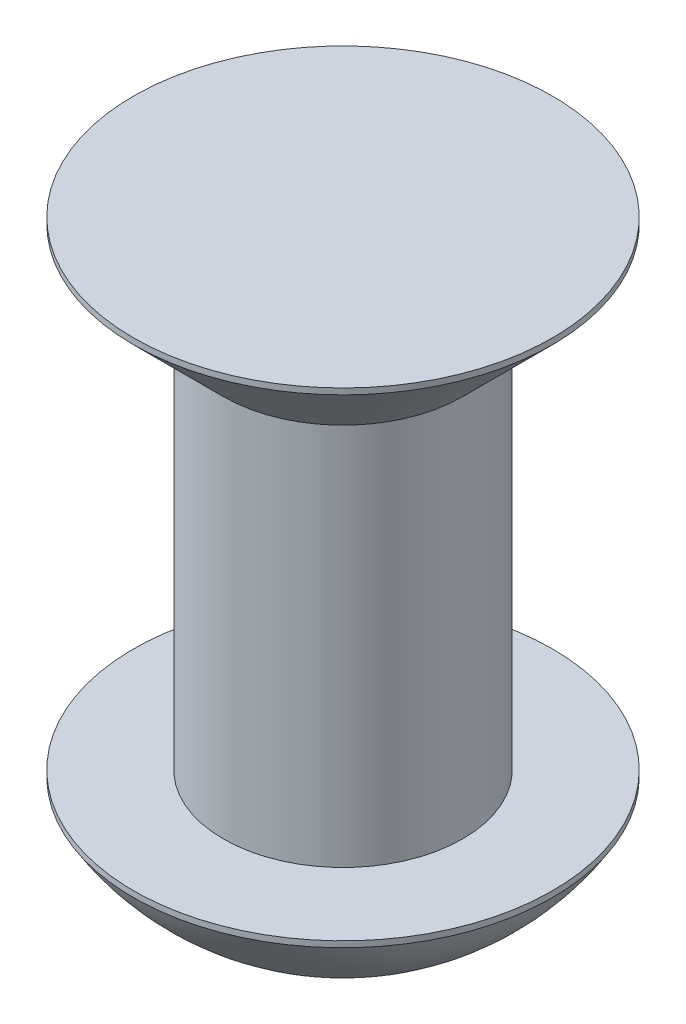
ISO-10303-21;
HEADER;
FILE_DESCRIPTION(('STEP AP214'),'2;1');
FILE_NAME('part.step','',(''),(''),'','','');
FILE_SCHEMA(('AUTOMOTIVE_DESIGN { 1 0 10303 214 1 1 1 1 }'));
ENDSEC;
DATA;
#1=APPLICATION_CONTEXT('core data for automotive mechanical design processes');
#2=APPLICATION_PROTOCOL_DEFINITION('international standard','automotive_design',2000,#1);
#3=PRODUCT_CONTEXT('',#1,'mechanical');
#4=PRODUCT('Part','Part','',(#3));
#5=PRODUCT_RELATED_PRODUCT_CATEGORY('part','',(#4));
#6=PRODUCT_DEFINITION_FORMATION('','',#4);
#7=PRODUCT_DEFINITION_CONTEXT('part definition',#1,'design');
#8=PRODUCT_DEFINITION('design','',#6,#7);
#9=PRODUCT_DEFINITION_SHAPE('','',#8);
#10=(LENGTH_UNIT() NAMED_UNIT(*) SI_UNIT(.MILLI.,.METRE.));
#11=(NAMED_UNIT(*) PLANE_ANGLE_UNIT() SI_UNIT($,.RADIAN.));
#12=(NAMED_UNIT(*) SI_UNIT($,.STERADIAN.) SOLID_ANGLE_UNIT());
#13=UNCERTAINTY_MEASURE_WITH_UNIT(LENGTH_MEASURE(1.E-05),#10,'distance_accuracy_value','');
#14=(GEOMETRIC_REPRESENTATION_CONTEXT(3) GLOBAL_UNCERTAINTY_ASSIGNED_CONTEXT((#13)) GLOBAL_UNIT_ASSIGNED_CONTEXT((#10,
#11,#12)) REPRESENTATION_CONTEXT('',''));
#15=CARTESIAN_POINT('',(0.,0.,0.));
#16=DIRECTION('',(0.,0.,1.));
#17=DIRECTION('',(1.,0.,0.));
#18=AXIS2_PLACEMENT_3D('',#15,#16,#17);
#19=CARTESIAN_POINT('',(3.5,7.6,0.));
#20=DIRECTION('',(0.,-1.,0.));
#21=DIRECTION('',(0.,0.,-1.));
#22=AXIS2_PLACEMENT_3D('',#19,#20,#21);
#23=PLANE('',#22);
#24=CARTESIAN_POINT('',(0.,7.6,0.));
#25=DIRECTION('',(0.,1.,0.));
#26=DIRECTION('',(0.,0.,1.));
#27=AXIS2_PLACEMENT_3D('',#24,#25,#26);
#28=CIRCLE('',#27,3.5);
#29=CARTESIAN_POINT('',(0.,7.6,3.5));
#30=VERTEX_POINT('',#29);
#31=EDGE_CURVE('E11',#30,#30,#28,.T.);
#32=ORIENTED_EDGE('',*,*,#31,.T.);
#33=EDGE_LOOP('',(#32));
#34=FACE_BOUND('',#33,.T.);
#35=ADVANCED_FACE('F31',(#34),#23,.F.);
#36=CARTESIAN_POINT('',(0.,11.2839721254355,0.));
#37=DIRECTION('',(0.,1.,0.));
#38=DIRECTION('',(0.,0.,1.));
#39=AXIS2_PLACEMENT_3D('',#36,#37,#38);
#40=CYLINDRICAL_SURFACE('',#39,3.5);
#41=ORIENTED_EDGE('',*,*,#31,.F.);
#42=EDGE_LOOP('',(#41));
#43=FACE_BOUND('',#42,.T.);
#44=CARTESIAN_POINT('',(0.,7.49999999999999,0.));
#45=DIRECTION('',(0.,1.,0.));
#46=DIRECTION('',(0.,0.,1.));
#47=AXIS2_PLACEMENT_3D('',#44,#45,#46);
#48=CIRCLE('',#47,3.5);
#49=CARTESIAN_POINT('',(0.,7.49999999999999,3.5));
#50=VERTEX_POINT('',#49);
#51=EDGE_CURVE('E39',#50,#50,#48,.T.);
#52=ORIENTED_EDGE('',*,*,#51,.T.);
#53=EDGE_LOOP('',(#52));
#54=FACE_BOUND('',#53,.T.);
#55=ADVANCED_FACE('F72',(#43,#54),#40,.T.);
#56=CARTESIAN_POINT('',(0.,6.,0.));
#57=DIRECTION('',(0.,1.,0.));
#58=DIRECTION('',(0.,0.,1.));
#59=AXIS2_PLACEMENT_3D('',#56,#57,#58);
#60=CONICAL_SURFACE('',#59,2.,0.78539816339745);
#61=ORIENTED_EDGE('',*,*,#51,.F.);
#62=EDGE_LOOP('',(#61));
#63=FACE_BOUND('',#62,.T.);
#64=CARTESIAN_POINT('',(0.,6.,0.));
#65=DIRECTION('',(0.,1.,0.));
#66=DIRECTION('',(0.,0.,1.));
#67=AXIS2_PLACEMENT_3D('',#64,#65,#66);
#68=CIRCLE('',#67,2.);
#69=CARTESIAN_POINT('',(0.,6.,2.));
#70=VERTEX_POINT('',#69);
#71=EDGE_CURVE('E43',#70,#70,#68,.T.);
#72=ORIENTED_EDGE('',*,*,#71,.T.);
#73=EDGE_LOOP('',(#72));
#74=FACE_BOUND('',#73,.T.);
#75=ADVANCED_FACE('F76',(#63,#74),#60,.T.);
#76=CARTESIAN_POINT('',(0.,11.2839721254355,0.));
#77=DIRECTION('',(0.,1.,0.));
#78=DIRECTION('',(0.,0.,1.));
#79=AXIS2_PLACEMENT_3D('',#76,#77,#78);
#80=CYLINDRICAL_SURFACE('',#79,2.);
#81=CARTESIAN_POINT('',(0.,-0.400000000000001,0.));
#82=DIRECTION('',(0.,-1.,0.));
#83=DIRECTION('',(0.,0.,-1.));
#84=AXIS2_PLACEMENT_3D('',#81,#82,#83);
#85=CIRCLE('',#84,2.);
#86=CARTESIAN_POINT('',(0.,-0.400000000000001,-2.));
#87=VERTEX_POINT('',#86);
#88=EDGE_CURVE('E48',#87,#87,#85,.T.);
#89=ORIENTED_EDGE('',*,*,#88,.F.);
#90=EDGE_LOOP('',(#89));
#91=FACE_BOUND('',#90,.T.);
#92=ORIENTED_EDGE('',*,*,#71,.F.);
#93=EDGE_LOOP('',(#92));
#94=FACE_BOUND('',#93,.T.);
#95=ADVANCED_FACE('F67',(#91,#94),#80,.T.);
#96=CARTESIAN_POINT('',(0.,-0.4,0.));
#97=DIRECTION('',(0.,-1.,0.));
#98=DIRECTION('',(0.,0.,-1.));
#99=AXIS2_PLACEMENT_3D('',#96,#97,#98);
#100=PLANE('',#99);
#101=CARTESIAN_POINT('',(0.,-0.4,0.));
#102=DIRECTION('',(0.,-1.,0.));
#103=DIRECTION('',(0.,0.,-1.));
#104=AXIS2_PLACEMENT_3D('',#101,#102,#103);
#105=CIRCLE('',#104,3.5);
#106=CARTESIAN_POINT('',(0.,-0.4,-3.5));
#107=VERTEX_POINT('',#106);
#108=EDGE_CURVE('E51',#107,#107,#105,.T.);
#109=ORIENTED_EDGE('',*,*,#108,.F.);
#110=EDGE_LOOP('',(#109));
#111=FACE_BOUND('',#110,.T.);
#112=ORIENTED_EDGE('',*,*,#88,.T.);
#113=EDGE_LOOP('',(#112));
#114=FACE_BOUND('',#113,.T.);
#115=ADVANCED_FACE('F61',(#111,#114),#100,.F.);
#116=CARTESIAN_POINT('',(0.,-0.5,0.));
#117=DIRECTION('',(0.,1.,0.));
#118=DIRECTION('',(0.,0.,1.));
#119=AXIS2_PLACEMENT_3D('',#116,#117,#118);
#120=CYLINDRICAL_SURFACE('',#119,3.5);
#121=CARTESIAN_POINT('',(0.,-0.5,0.));
#122=DIRECTION('',(0.,-1.,0.));
#123=DIRECTION('',(0.,0.,-1.));
#124=AXIS2_PLACEMENT_3D('',#121,#122,#123);
#125=CIRCLE('',#124,3.5);
#126=CARTESIAN_POINT('',(0.,-0.5,-3.5));
#127=VERTEX_POINT('',#126);
#128=EDGE_CURVE('E35',#127,#127,#125,.T.);
#129=ORIENTED_EDGE('',*,*,#128,.F.);
#130=EDGE_LOOP('',(#129));
#131=FACE_BOUND('',#130,.T.);
#132=ORIENTED_EDGE('',*,*,#108,.T.);
#133=EDGE_LOOP('',(#132));
#134=FACE_BOUND('',#133,.T.);
#135=ADVANCED_FACE('F59',(#131,#134),#120,.T.);
#136=CARTESIAN_POINT('',(0.,1.5625,0.));
#137=DIRECTION('',(0.,0.,1.));
#138=DIRECTION('',(1.,0.,0.));
#139=AXIS2_PLACEMENT_3D('',#136,#137,#138);
#140=SPHERICAL_SURFACE('',#139,4.0625);
#141=CARTESIAN_POINT('',(0.,1.5625,0.));
#142=DIRECTION('',(0.,-1.,0.));
#143=DIRECTION('',(0.,0.,-1.));
#144=AXIS2_PLACEMENT_3D('',#141,#142,#143);
#145=SPHERICAL_SURFACE('',#144,4.0625);
#146=ORIENTED_EDGE('',*,*,#128,.T.);
#147=EDGE_LOOP('',(#146));
#148=FACE_BOUND('',#147,.T.);
#149=ADVANCED_FACE('F33',(#148),#145,.T.);
#150=CLOSED_SHELL('',(#35,#55,#75,#95,#115,#135,#149));
#151=MANIFOLD_SOLID_BREP('B2',#150);
#152=ADVANCED_BREP_SHAPE_REPRESENTATION('',(#18,#151),#14);
#153=SHAPE_DEFINITION_REPRESENTATION(#9,#152);
ENDSEC;
END-ISO-10303-21;
